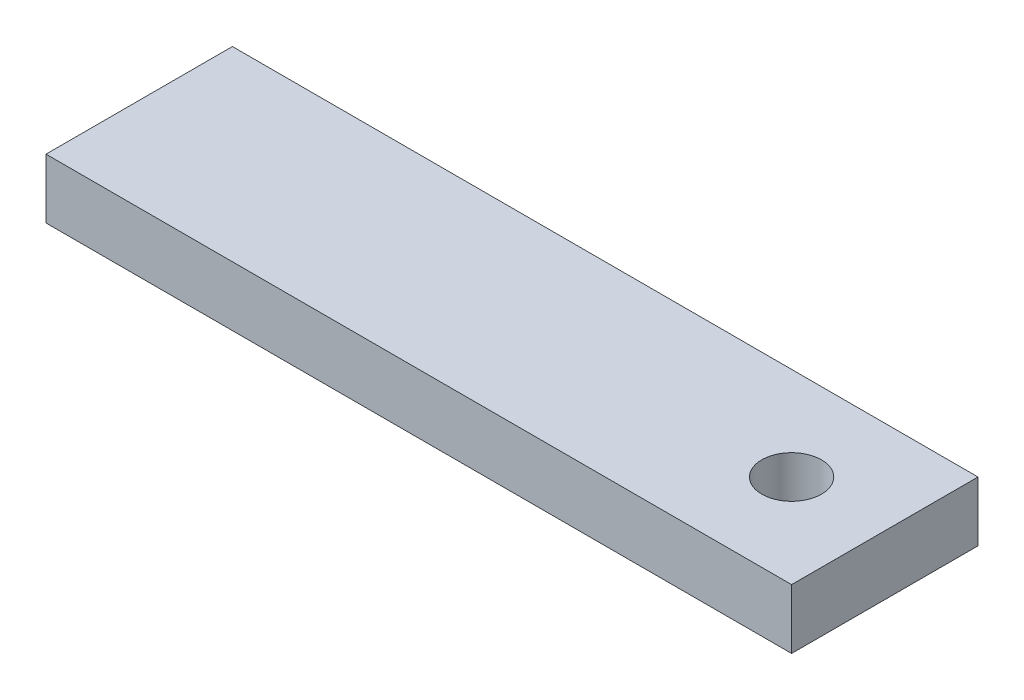
ISO-10303-21;
HEADER;
FILE_DESCRIPTION(('STEP AP214'),'2;1');
FILE_NAME('part.step','',(''),(''),'','','');
FILE_SCHEMA(('AUTOMOTIVE_DESIGN { 1 0 10303 214 1 1 1 1 }'));
ENDSEC;
DATA;
#1=APPLICATION_CONTEXT('core data for automotive mechanical design processes');
#2=APPLICATION_PROTOCOL_DEFINITION('international standard','automotive_design',2000,#1);
#3=PRODUCT_CONTEXT('',#1,'mechanical');
#4=PRODUCT('Part','Part','',(#3));
#5=PRODUCT_RELATED_PRODUCT_CATEGORY('part','',(#4));
#6=PRODUCT_DEFINITION_FORMATION('','',#4);
#7=PRODUCT_DEFINITION_CONTEXT('part definition',#1,'design');
#8=PRODUCT_DEFINITION('design','',#6,#7);
#9=PRODUCT_DEFINITION_SHAPE('','',#8);
#10=(LENGTH_UNIT() NAMED_UNIT(*) SI_UNIT(.MILLI.,.METRE.));
#11=(NAMED_UNIT(*) PLANE_ANGLE_UNIT() SI_UNIT($,.RADIAN.));
#12=(NAMED_UNIT(*) SI_UNIT($,.STERADIAN.) SOLID_ANGLE_UNIT());
#13=UNCERTAINTY_MEASURE_WITH_UNIT(LENGTH_MEASURE(1.E-05),#10,'distance_accuracy_value','');
#14=(GEOMETRIC_REPRESENTATION_CONTEXT(3) GLOBAL_UNCERTAINTY_ASSIGNED_CONTEXT((#13)) GLOBAL_UNIT_ASSIGNED_CONTEXT((#10,
#11,#12)) REPRESENTATION_CONTEXT('',''));
#15=CARTESIAN_POINT('',(0.,0.,0.));
#16=DIRECTION('',(0.,0.,1.));
#17=DIRECTION('',(1.,0.,0.));
#18=AXIS2_PLACEMENT_3D('',#15,#16,#17);
#19=CARTESIAN_POINT('',(0.,8.,0.));
#20=DIRECTION('',(0.,1.,0.));
#21=DIRECTION('',(0.,0.,1.));
#22=AXIS2_PLACEMENT_3D('',#19,#20,#21);
#23=PLANE('',#22);
#24=DIRECTION('',(0.,0.,-1.));
#25=VECTOR('',#24,1.);
#26=CARTESIAN_POINT('',(50.,8.,-12.5));
#27=LINE('',#26,#25);
#28=CARTESIAN_POINT('',(50.,8.,12.5));
#29=VERTEX_POINT('',#28);
#30=CARTESIAN_POINT('',(50.,8.,-12.5));
#31=VERTEX_POINT('',#30);
#32=EDGE_CURVE('E84',#29,#31,#27,.T.);
#33=ORIENTED_EDGE('',*,*,#32,.T.);
#34=DIRECTION('',(-1.,0.,0.));
#35=VECTOR('',#34,1.);
#36=CARTESIAN_POINT('',(-50.,8.,-12.5));
#37=LINE('',#36,#35);
#38=CARTESIAN_POINT('',(-50.,8.,-12.5));
#39=VERTEX_POINT('',#38);
#40=EDGE_CURVE('E79',#31,#39,#37,.T.);
#41=ORIENTED_EDGE('',*,*,#40,.T.);
#42=DIRECTION('',(0.,0.,1.));
#43=VECTOR('',#42,1.);
#44=CARTESIAN_POINT('',(-50.,8.,-12.5));
#45=LINE('',#44,#43);
#46=CARTESIAN_POINT('',(-50.,8.,12.5));
#47=VERTEX_POINT('',#46);
#48=EDGE_CURVE('E82',#39,#47,#45,.T.);
#49=ORIENTED_EDGE('',*,*,#48,.T.);
#50=DIRECTION('',(1.,0.,0.));
#51=VECTOR('',#50,1.);
#52=CARTESIAN_POINT('',(-50.,8.,12.5));
#53=LINE('',#52,#51);
#54=EDGE_CURVE('E49',#47,#29,#53,.T.);
#55=ORIENTED_EDGE('',*,*,#54,.T.);
#56=EDGE_LOOP('',(#33,#41,#49,#55));
#57=FACE_BOUND('',#56,.T.);
#58=CARTESIAN_POINT('',(37.5,8.,0.));
#59=DIRECTION('',(0.,1.,0.));
#60=DIRECTION('',(0.,0.,1.));
#61=AXIS2_PLACEMENT_3D('',#58,#59,#60);
#62=CIRCLE('',#61,4.00000000000001);
#63=CARTESIAN_POINT('',(37.5,8.,4.00000000000001));
#64=VERTEX_POINT('',#63);
#65=EDGE_CURVE('E99',#64,#64,#62,.T.);
#66=ORIENTED_EDGE('',*,*,#65,.F.);
#67=EDGE_LOOP('',(#66));
#68=FACE_BOUND('',#67,.T.);
#69=ADVANCED_FACE('F32',(#57,#68),#23,.T.);
#70=CARTESIAN_POINT('',(0.,0.,0.));
#71=DIRECTION('',(0.,1.,0.));
#72=DIRECTION('',(0.,0.,1.));
#73=AXIS2_PLACEMENT_3D('',#70,#71,#72);
#74=PLANE('',#73);
#75=DIRECTION('',(0.,0.,-1.));
#76=VECTOR('',#75,1.);
#77=CARTESIAN_POINT('',(50.,0.,-12.5));
#78=LINE('',#77,#76);
#79=CARTESIAN_POINT('',(50.,0.,12.5));
#80=VERTEX_POINT('',#79);
#81=CARTESIAN_POINT('',(50.,0.,-12.5));
#82=VERTEX_POINT('',#81);
#83=EDGE_CURVE('E96',#80,#82,#78,.T.);
#84=ORIENTED_EDGE('',*,*,#83,.F.);
#85=DIRECTION('',(1.,0.,0.));
#86=VECTOR('',#85,1.);
#87=CARTESIAN_POINT('',(-50.,0.,12.5));
#88=LINE('',#87,#86);
#89=CARTESIAN_POINT('',(-50.,0.,12.5));
#90=VERTEX_POINT('',#89);
#91=EDGE_CURVE('E72',#90,#80,#88,.T.);
#92=ORIENTED_EDGE('',*,*,#91,.F.);
#93=DIRECTION('',(0.,0.,1.));
#94=VECTOR('',#93,1.);
#95=CARTESIAN_POINT('',(-50.,0.,-12.5));
#96=LINE('',#95,#94);
#97=CARTESIAN_POINT('',(-50.,0.,-12.5));
#98=VERTEX_POINT('',#97);
#99=EDGE_CURVE('E66',#98,#90,#96,.T.);
#100=ORIENTED_EDGE('',*,*,#99,.F.);
#101=DIRECTION('',(-1.,0.,0.));
#102=VECTOR('',#101,1.);
#103=CARTESIAN_POINT('',(-50.,0.,-12.5));
#104=LINE('',#103,#102);
#105=EDGE_CURVE('E88',#82,#98,#104,.T.);
#106=ORIENTED_EDGE('',*,*,#105,.F.);
#107=EDGE_LOOP('',(#84,#92,#100,#106));
#108=FACE_BOUND('',#107,.T.);
#109=CARTESIAN_POINT('',(37.5,0.,0.));
#110=DIRECTION('',(0.,1.,0.));
#111=DIRECTION('',(0.,0.,1.));
#112=AXIS2_PLACEMENT_3D('',#109,#110,#111);
#113=CIRCLE('',#112,4.00000000000001);
#114=CARTESIAN_POINT('',(37.5,0.,4.00000000000001));
#115=VERTEX_POINT('',#114);
#116=EDGE_CURVE('E111',#115,#115,#113,.T.);
#117=ORIENTED_EDGE('',*,*,#116,.T.);
#118=EDGE_LOOP('',(#117));
#119=FACE_BOUND('',#118,.T.);
#120=ADVANCED_FACE('F107',(#108,#119),#74,.F.);
#121=CARTESIAN_POINT('',(50.,8.,-12.5));
#122=DIRECTION('',(-1.,0.,0.));
#123=DIRECTION('',(0.,0.,1.));
#124=AXIS2_PLACEMENT_3D('',#121,#122,#123);
#125=PLANE('',#124);
#126=ORIENTED_EDGE('',*,*,#83,.T.);
#127=DIRECTION('',(0.,-1.,0.));
#128=VECTOR('',#127,1.);
#129=CARTESIAN_POINT('',(50.,8.,-12.5));
#130=LINE('',#129,#128);
#131=EDGE_CURVE('E11',#31,#82,#130,.T.);
#132=ORIENTED_EDGE('',*,*,#131,.F.);
#133=ORIENTED_EDGE('',*,*,#32,.F.);
#134=DIRECTION('',(0.,-1.,0.));
#135=VECTOR('',#134,1.);
#136=CARTESIAN_POINT('',(50.,8.,12.5));
#137=LINE('',#136,#135);
#138=EDGE_CURVE('E92',#29,#80,#137,.T.);
#139=ORIENTED_EDGE('',*,*,#138,.T.);
#140=EDGE_LOOP('',(#126,#132,#133,#139));
#141=FACE_BOUND('',#140,.T.);
#142=ADVANCED_FACE('F34',(#141),#125,.F.);
#143=CARTESIAN_POINT('',(-50.,8.,-12.5));
#144=DIRECTION('',(0.,0.,1.));
#145=DIRECTION('',(1.,0.,0.));
#146=AXIS2_PLACEMENT_3D('',#143,#144,#145);
#147=PLANE('',#146);
#148=ORIENTED_EDGE('',*,*,#105,.T.);
#149=DIRECTION('',(0.,-1.,0.));
#150=VECTOR('',#149,1.);
#151=CARTESIAN_POINT('',(-50.,8.,-12.5));
#152=LINE('',#151,#150);
#153=EDGE_CURVE('E41',#39,#98,#152,.T.);
#154=ORIENTED_EDGE('',*,*,#153,.F.);
#155=ORIENTED_EDGE('',*,*,#40,.F.);
#156=ORIENTED_EDGE('',*,*,#131,.T.);
#157=EDGE_LOOP('',(#148,#154,#155,#156));
#158=FACE_BOUND('',#157,.T.);
#159=ADVANCED_FACE('F87',(#158),#147,.F.);
#160=CARTESIAN_POINT('',(-50.,8.,-12.5));
#161=DIRECTION('',(1.,0.,0.));
#162=DIRECTION('',(0.,0.,-1.));
#163=AXIS2_PLACEMENT_3D('',#160,#161,#162);
#164=PLANE('',#163);
#165=ORIENTED_EDGE('',*,*,#99,.T.);
#166=DIRECTION('',(0.,-1.,0.));
#167=VECTOR('',#166,1.);
#168=CARTESIAN_POINT('',(-50.,8.,12.5));
#169=LINE('',#168,#167);
#170=EDGE_CURVE('E89',#47,#90,#169,.T.);
#171=ORIENTED_EDGE('',*,*,#170,.F.);
#172=ORIENTED_EDGE('',*,*,#48,.F.);
#173=ORIENTED_EDGE('',*,*,#153,.T.);
#174=EDGE_LOOP('',(#165,#171,#172,#173));
#175=FACE_BOUND('',#174,.T.);
#176=ADVANCED_FACE('F90',(#175),#164,.F.);
#177=CARTESIAN_POINT('',(-50.,8.,12.5));
#178=DIRECTION('',(0.,0.,-1.));
#179=DIRECTION('',(-1.,0.,0.));
#180=AXIS2_PLACEMENT_3D('',#177,#178,#179);
#181=PLANE('',#180);
#182=ORIENTED_EDGE('',*,*,#91,.T.);
#183=ORIENTED_EDGE('',*,*,#138,.F.);
#184=ORIENTED_EDGE('',*,*,#54,.F.);
#185=ORIENTED_EDGE('',*,*,#170,.T.);
#186=EDGE_LOOP('',(#182,#183,#184,#185));
#187=FACE_BOUND('',#186,.T.);
#188=ADVANCED_FACE('F104',(#187),#181,.F.);
#189=CARTESIAN_POINT('',(37.5,8.,0.));
#190=DIRECTION('',(0.,-1.,0.));
#191=DIRECTION('',(0.,0.,-1.));
#192=AXIS2_PLACEMENT_3D('',#189,#190,#191);
#193=CYLINDRICAL_SURFACE('',#192,4.00000000000001);
#194=ORIENTED_EDGE('',*,*,#65,.T.);
#195=EDGE_LOOP('',(#194));
#196=FACE_BOUND('',#195,.T.);
#197=ORIENTED_EDGE('',*,*,#116,.F.);
#198=EDGE_LOOP('',(#197));
#199=FACE_BOUND('',#198,.T.);
#200=ADVANCED_FACE('F117',(#196,#199),#193,.F.);
#201=CLOSED_SHELL('',(#69,#120,#142,#159,#176,#188,#200));
#202=MANIFOLD_SOLID_BREP('B2',#201);
#203=ADVANCED_BREP_SHAPE_REPRESENTATION('',(#18,#202),#14);
#204=SHAPE_DEFINITION_REPRESENTATION(#9,#203);
ENDSEC;
END-ISO-10303-21;
